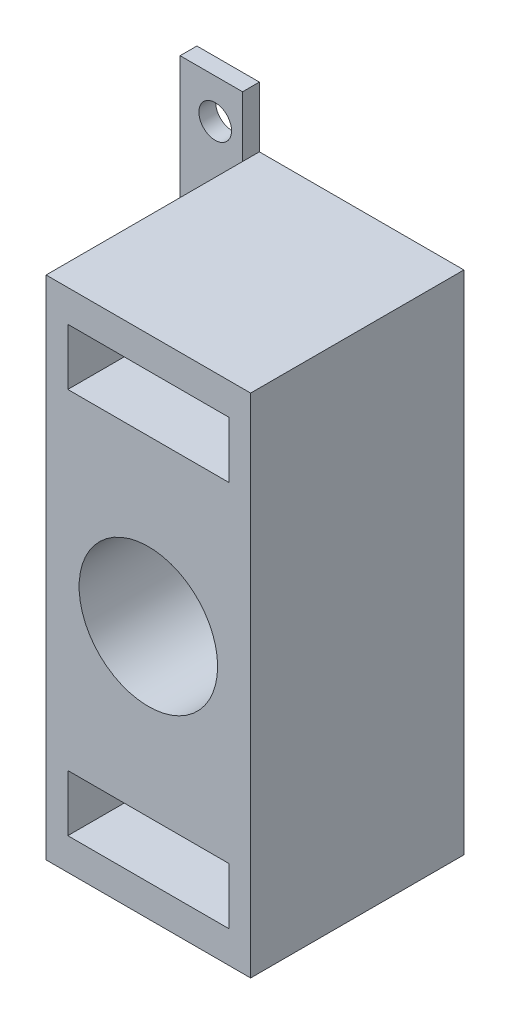
ISO-10303-21;
HEADER;
FILE_DESCRIPTION(('STEP AP214'),'2;1');
FILE_NAME('part.step','',(''),(''),'','','');
FILE_SCHEMA(('AUTOMOTIVE_DESIGN { 1 0 10303 214 1 1 1 1 }'));
ENDSEC;
DATA;
#1=APPLICATION_CONTEXT('core data for automotive mechanical design processes');
#2=APPLICATION_PROTOCOL_DEFINITION('international standard','automotive_design',2000,#1);
#3=PRODUCT_CONTEXT('',#1,'mechanical');
#4=PRODUCT('Part','Part','',(#3));
#5=PRODUCT_RELATED_PRODUCT_CATEGORY('part','',(#4));
#6=PRODUCT_DEFINITION_FORMATION('','',#4);
#7=PRODUCT_DEFINITION_CONTEXT('part definition',#1,'design');
#8=PRODUCT_DEFINITION('design','',#6,#7);
#9=PRODUCT_DEFINITION_SHAPE('','',#8);
#10=(LENGTH_UNIT() NAMED_UNIT(*) SI_UNIT(.MILLI.,.METRE.));
#11=(NAMED_UNIT(*) PLANE_ANGLE_UNIT() SI_UNIT($,.RADIAN.));
#12=(NAMED_UNIT(*) SI_UNIT($,.STERADIAN.) SOLID_ANGLE_UNIT());
#13=UNCERTAINTY_MEASURE_WITH_UNIT(LENGTH_MEASURE(1.E-05),#10,'distance_accuracy_value','');
#14=(GEOMETRIC_REPRESENTATION_CONTEXT(3) GLOBAL_UNCERTAINTY_ASSIGNED_CONTEXT((#13)) GLOBAL_UNIT_ASSIGNED_CONTEXT((#10,
#11,#12)) REPRESENTATION_CONTEXT('',''));
#15=CARTESIAN_POINT('',(0.,0.,0.));
#16=DIRECTION('',(0.,0.,1.));
#17=DIRECTION('',(1.,0.,0.));
#18=AXIS2_PLACEMENT_3D('',#15,#16,#17);
#19=CARTESIAN_POINT('',(-30.4500119994615,75.4141716566866,63.5));
#20=DIRECTION('',(1.,0.,0.));
#21=DIRECTION('',(0.,0.,-1.));
#22=AXIS2_PLACEMENT_3D('',#19,#20,#21);
#23=PLANE('',#22);
#24=DIRECTION('',(0.,1.,0.));
#25=VECTOR('',#24,1.);
#26=CARTESIAN_POINT('',(-30.4500119994615,0.,5.));
#27=LINE('',#26,#25);
#28=CARTESIAN_POINT('',(-30.4500119994615,0.,5.));
#29=VERTEX_POINT('',#28);
#30=CARTESIAN_POINT('',(-30.4500119994615,75.4141716566866,5.));
#31=VERTEX_POINT('',#30);
#32=EDGE_CURVE('E178',#29,#31,#27,.T.);
#33=ORIENTED_EDGE('',*,*,#32,.F.);
#34=DIRECTION('',(0.,0.,-1.));
#35=VECTOR('',#34,1.);
#36=CARTESIAN_POINT('',(-30.4500119994615,0.,5.));
#37=LINE('',#36,#35);
#38=CARTESIAN_POINT('',(-30.4500119994615,0.,0.));
#39=VERTEX_POINT('',#38);
#40=EDGE_CURVE('E181',#29,#39,#37,.T.);
#41=ORIENTED_EDGE('',*,*,#40,.T.);
#42=DIRECTION('',(0.,-1.,0.));
#43=VECTOR('',#42,1.);
#44=CARTESIAN_POINT('',(-30.4500119994615,75.4141716566866,0.));
#45=LINE('',#44,#43);
#46=CARTESIAN_POINT('',(-30.4500119994615,-75.4141716566866,0.));
#47=VERTEX_POINT('',#46);
#48=EDGE_CURVE('E338',#39,#47,#45,.T.);
#49=ORIENTED_EDGE('',*,*,#48,.T.);
#50=DIRECTION('',(0.,0.,-1.));
#51=VECTOR('',#50,1.);
#52=CARTESIAN_POINT('',(-30.4500119994615,-75.4141716566866,63.5));
#53=LINE('',#52,#51);
#54=CARTESIAN_POINT('',(-30.4500119994615,-75.4141716566866,63.5));
#55=VERTEX_POINT('',#54);
#56=EDGE_CURVE('E346',#55,#47,#53,.T.);
#57=ORIENTED_EDGE('',*,*,#56,.F.);
#58=DIRECTION('',(0.,-1.,0.));
#59=VECTOR('',#58,1.);
#60=CARTESIAN_POINT('',(-30.4500119994615,75.4141716566866,63.5));
#61=LINE('',#60,#59);
#62=CARTESIAN_POINT('',(-30.4500119994615,75.4141716566866,63.5));
#63=VERTEX_POINT('',#62);
#64=EDGE_CURVE('E324',#63,#55,#61,.T.);
#65=ORIENTED_EDGE('',*,*,#64,.F.);
#66=DIRECTION('',(0.,0.,-1.));
#67=VECTOR('',#66,1.);
#68=CARTESIAN_POINT('',(-30.4500119994615,75.4141716566866,63.5));
#69=LINE('',#68,#67);
#70=EDGE_CURVE('E50',#63,#31,#69,.T.);
#71=ORIENTED_EDGE('',*,*,#70,.T.);
#72=EDGE_LOOP('',(#33,#41,#49,#57,#65,#71));
#73=FACE_BOUND('',#72,.T.);
#74=ADVANCED_FACE('F41',(#73),#23,.F.);
#75=CARTESIAN_POINT('',(0.,0.,63.5));
#76=DIRECTION('',(0.,0.,1.));
#77=DIRECTION('',(1.,0.,0.));
#78=AXIS2_PLACEMENT_3D('',#75,#76,#77);
#79=PLANE('',#78);
#80=DIRECTION('',(-1.,0.,0.));
#81=VECTOR('',#80,1.);
#82=CARTESIAN_POINT('',(-23.985940143174,65.9335329341317,63.5));
#83=LINE('',#82,#81);
#84=CARTESIAN_POINT('',(23.9859401431741,65.9335329341317,63.5));
#85=VERTEX_POINT('',#84);
#86=CARTESIAN_POINT('',(-23.985940143174,65.9335329341317,63.5));
#87=VERTEX_POINT('',#86);
#88=EDGE_CURVE('E235',#85,#87,#83,.T.);
#89=ORIENTED_EDGE('',*,*,#88,.F.);
#90=DIRECTION('',(0.,1.,0.));
#91=VECTOR('',#90,1.);
#92=CARTESIAN_POINT('',(23.9859401431741,65.9335329341317,63.5));
#93=LINE('',#92,#91);
#94=CARTESIAN_POINT('',(23.9859401431741,49.1269461077844,63.5));
#95=VERTEX_POINT('',#94);
#96=EDGE_CURVE('E232',#95,#85,#93,.T.);
#97=ORIENTED_EDGE('',*,*,#96,.F.);
#98=DIRECTION('',(1.,0.,0.));
#99=VECTOR('',#98,1.);
#100=CARTESIAN_POINT('',(-23.985940143174,49.1269461077844,63.5));
#101=LINE('',#100,#99);
#102=CARTESIAN_POINT('',(-23.985940143174,49.1269461077844,63.5));
#103=VERTEX_POINT('',#102);
#104=EDGE_CURVE('E242',#103,#95,#101,.T.);
#105=ORIENTED_EDGE('',*,*,#104,.F.);
#106=DIRECTION('',(0.,-1.,0.));
#107=VECTOR('',#106,1.);
#108=CARTESIAN_POINT('',(-23.985940143174,65.9335329341317,63.5));
#109=LINE('',#108,#107);
#110=EDGE_CURVE('E239',#87,#103,#109,.T.);
#111=ORIENTED_EDGE('',*,*,#110,.F.);
#112=EDGE_LOOP('',(#89,#97,#105,#111));
#113=FACE_BOUND('',#112,.T.);
#114=DIRECTION('',(1.,0.,0.));
#115=VECTOR('',#114,1.);
#116=CARTESIAN_POINT('',(-23.985940143174,-65.9335329341317,63.5));
#117=LINE('',#116,#115);
#118=CARTESIAN_POINT('',(-23.985940143174,-65.9335329341317,63.5));
#119=VERTEX_POINT('',#118);
#120=CARTESIAN_POINT('',(23.9859401431741,-65.9335329341317,63.5));
#121=VERTEX_POINT('',#120);
#122=EDGE_CURVE('E276',#119,#121,#117,.T.);
#123=ORIENTED_EDGE('',*,*,#122,.F.);
#124=DIRECTION('',(0.,-1.,0.));
#125=VECTOR('',#124,1.);
#126=CARTESIAN_POINT('',(-23.985940143174,-65.9335329341317,63.5));
#127=LINE('',#126,#125);
#128=CARTESIAN_POINT('',(-23.985940143174,-49.1269461077844,63.5));
#129=VERTEX_POINT('',#128);
#130=EDGE_CURVE('E273',#129,#119,#127,.T.);
#131=ORIENTED_EDGE('',*,*,#130,.F.);
#132=DIRECTION('',(-1.,0.,0.));
#133=VECTOR('',#132,1.);
#134=CARTESIAN_POINT('',(-23.985940143174,-49.1269461077844,63.5));
#135=LINE('',#134,#133);
#136=CARTESIAN_POINT('',(23.9859401431741,-49.1269461077844,63.5));
#137=VERTEX_POINT('',#136);
#138=EDGE_CURVE('E284',#137,#129,#135,.T.);
#139=ORIENTED_EDGE('',*,*,#138,.F.);
#140=DIRECTION('',(0.,1.,0.));
#141=VECTOR('',#140,1.);
#142=CARTESIAN_POINT('',(23.9859401431741,-65.9335329341317,63.5));
#143=LINE('',#142,#141);
#144=EDGE_CURVE('E280',#121,#137,#143,.T.);
#145=ORIENTED_EDGE('',*,*,#144,.F.);
#146=EDGE_LOOP('',(#123,#131,#139,#145));
#147=FACE_BOUND('',#146,.T.);
#148=DIRECTION('',(0.,1.,0.));
#149=VECTOR('',#148,1.);
#150=CARTESIAN_POINT('',(30.4500119994615,75.4141716566866,63.5));
#151=LINE('',#150,#149);
#152=CARTESIAN_POINT('',(30.4500119994615,-75.4141716566866,63.5));
#153=VERTEX_POINT('',#152);
#154=CARTESIAN_POINT('',(30.4500119994615,75.4141716566866,63.5));
#155=VERTEX_POINT('',#154);
#156=EDGE_CURVE('E316',#153,#155,#151,.T.);
#157=ORIENTED_EDGE('',*,*,#156,.T.);
#158=DIRECTION('',(-1.,0.,0.));
#159=VECTOR('',#158,1.);
#160=CARTESIAN_POINT('',(-30.4500119994615,75.4141716566866,63.5));
#161=LINE('',#160,#159);
#162=EDGE_CURVE('E320',#155,#63,#161,.T.);
#163=ORIENTED_EDGE('',*,*,#162,.T.);
#164=ORIENTED_EDGE('',*,*,#64,.T.);
#165=DIRECTION('',(1.,0.,0.));
#166=VECTOR('',#165,1.);
#167=CARTESIAN_POINT('',(-30.4500119994615,-75.4141716566866,63.5));
#168=LINE('',#167,#166);
#169=EDGE_CURVE('E327',#55,#153,#168,.T.);
#170=ORIENTED_EDGE('',*,*,#169,.T.);
#171=EDGE_LOOP('',(#157,#163,#164,#170));
#172=FACE_BOUND('',#171,.T.);
#173=CARTESIAN_POINT('',(0.,0.,63.5));
#174=DIRECTION('',(0.,0.,1.));
#175=DIRECTION('',(1.,0.,0.));
#176=AXIS2_PLACEMENT_3D('',#173,#174,#175);
#177=CIRCLE('',#176,20.6182325220097);
#178=CARTESIAN_POINT('',(20.6182325220097,0.,63.5));
#179=VERTEX_POINT('',#178);
#180=EDGE_CURVE('E224',#179,#179,#177,.T.);
#181=ORIENTED_EDGE('',*,*,#180,.F.);
#182=EDGE_LOOP('',(#181));
#183=FACE_BOUND('',#182,.T.);
#184=ADVANCED_FACE('F395',(#113,#147,#172,#183),#79,.T.);
#185=CARTESIAN_POINT('',(0.,0.,0.));
#186=DIRECTION('',(0.,0.,1.));
#187=DIRECTION('',(1.,0.,0.));
#188=AXIS2_PLACEMENT_3D('',#185,#186,#187);
#189=PLANE('',#188);
#190=DIRECTION('',(0.,-1.,0.));
#191=VECTOR('',#190,1.);
#192=CARTESIAN_POINT('',(-23.985940143174,-65.9335329341317,0.));
#193=LINE('',#192,#191);
#194=CARTESIAN_POINT('',(-23.985940143174,-49.1269461077844,0.));
#195=VERTEX_POINT('',#194);
#196=CARTESIAN_POINT('',(-23.985940143174,-65.9335329341317,0.));
#197=VERTEX_POINT('',#196);
#198=EDGE_CURVE('E272',#195,#197,#193,.T.);
#199=ORIENTED_EDGE('',*,*,#198,.T.);
#200=DIRECTION('',(1.,0.,0.));
#201=VECTOR('',#200,1.);
#202=CARTESIAN_POINT('',(-23.985940143174,-65.9335329341317,0.));
#203=LINE('',#202,#201);
#204=CARTESIAN_POINT('',(23.9859401431741,-65.9335329341317,0.));
#205=VERTEX_POINT('',#204);
#206=EDGE_CURVE('E291',#197,#205,#203,.T.);
#207=ORIENTED_EDGE('',*,*,#206,.T.);
#208=DIRECTION('',(0.,1.,0.));
#209=VECTOR('',#208,1.);
#210=CARTESIAN_POINT('',(23.9859401431741,-65.9335329341317,0.));
#211=LINE('',#210,#209);
#212=CARTESIAN_POINT('',(23.9859401431741,-49.1269461077844,0.));
#213=VERTEX_POINT('',#212);
#214=EDGE_CURVE('E295',#205,#213,#211,.T.);
#215=ORIENTED_EDGE('',*,*,#214,.T.);
#216=DIRECTION('',(-1.,0.,0.));
#217=VECTOR('',#216,1.);
#218=CARTESIAN_POINT('',(-23.985940143174,-49.1269461077844,0.));
#219=LINE('',#218,#217);
#220=EDGE_CURVE('E277',#213,#195,#219,.T.);
#221=ORIENTED_EDGE('',*,*,#220,.T.);
#222=EDGE_LOOP('',(#199,#207,#215,#221));
#223=FACE_BOUND('',#222,.T.);
#224=DIRECTION('',(0.,1.,0.));
#225=VECTOR('',#224,1.);
#226=CARTESIAN_POINT('',(30.4500119994615,75.4141716566866,0.));
#227=LINE('',#226,#225);
#228=CARTESIAN_POINT('',(30.4500119994615,-75.4141716566866,0.));
#229=VERTEX_POINT('',#228);
#230=CARTESIAN_POINT('',(30.4500119994615,75.4141716566866,0.));
#231=VERTEX_POINT('',#230);
#232=EDGE_CURVE('E315',#229,#231,#227,.T.);
#233=ORIENTED_EDGE('',*,*,#232,.F.);
#234=DIRECTION('',(1.,0.,0.));
#235=VECTOR('',#234,1.);
#236=CARTESIAN_POINT('',(-30.4500119994615,-75.4141716566866,0.));
#237=LINE('',#236,#235);
#238=EDGE_CURVE('E321',#47,#229,#237,.T.);
#239=ORIENTED_EDGE('',*,*,#238,.F.);
#240=ORIENTED_EDGE('',*,*,#48,.F.);
#241=DIRECTION('',(1.,0.,0.));
#242=VECTOR('',#241,1.);
#243=CARTESIAN_POINT('',(0.,0.,0.));
#244=LINE('',#243,#242);
#245=CARTESIAN_POINT('',(-49.0484048742105,0.,0.));
#246=VERTEX_POINT('',#245);
#247=EDGE_CURVE('E57',#246,#39,#244,.T.);
#248=ORIENTED_EDGE('',*,*,#247,.F.);
#249=DIRECTION('',(0.,-1.,0.));
#250=VECTOR('',#249,1.);
#251=CARTESIAN_POINT('',(-49.0484048742105,0.,0.));
#252=LINE('',#251,#250);
#253=CARTESIAN_POINT('',(-49.0484048742105,93.4052231952363,0.));
#254=VERTEX_POINT('',#253);
#255=EDGE_CURVE('E175',#254,#246,#252,.T.);
#256=ORIENTED_EDGE('',*,*,#255,.F.);
#257=DIRECTION('',(-1.,0.,0.));
#258=VECTOR('',#257,1.);
#259=CARTESIAN_POINT('',(0.,93.4052231952363,0.));
#260=LINE('',#259,#258);
#261=CARTESIAN_POINT('',(-30.4500119994615,93.4052231952363,0.));
#262=VERTEX_POINT('',#261);
#263=EDGE_CURVE('E209',#262,#254,#260,.T.);
#264=ORIENTED_EDGE('',*,*,#263,.F.);
#265=DIRECTION('',(0.,1.,0.));
#266=VECTOR('',#265,1.);
#267=CARTESIAN_POINT('',(-30.4500119994615,0.,0.));
#268=LINE('',#267,#266);
#269=CARTESIAN_POINT('',(-30.4500119994615,75.4141716566866,0.));
#270=VERTEX_POINT('',#269);
#271=EDGE_CURVE('E212',#270,#262,#268,.T.);
#272=ORIENTED_EDGE('',*,*,#271,.F.);
#273=DIRECTION('',(-1.,0.,0.));
#274=VECTOR('',#273,1.);
#275=CARTESIAN_POINT('',(-30.4500119994615,75.4141716566866,0.));
#276=LINE('',#275,#274);
#277=EDGE_CURVE('E334',#231,#270,#276,.T.);
#278=ORIENTED_EDGE('',*,*,#277,.F.);
#279=EDGE_LOOP('',(#233,#239,#240,#248,#256,#264,#272,#278));
#280=FACE_BOUND('',#279,.T.);
#281=DIRECTION('',(0.,1.,0.));
#282=VECTOR('',#281,1.);
#283=CARTESIAN_POINT('',(23.9859401431741,65.9335329341317,0.));
#284=LINE('',#283,#282);
#285=CARTESIAN_POINT('',(23.9859401431741,49.1269461077844,0.));
#286=VERTEX_POINT('',#285);
#287=CARTESIAN_POINT('',(23.9859401431741,65.9335329341317,0.));
#288=VERTEX_POINT('',#287);
#289=EDGE_CURVE('E228',#286,#288,#284,.T.);
#290=ORIENTED_EDGE('',*,*,#289,.T.);
#291=DIRECTION('',(-1.,0.,0.));
#292=VECTOR('',#291,1.);
#293=CARTESIAN_POINT('',(-23.985940143174,65.9335329341317,0.));
#294=LINE('',#293,#292);
#295=CARTESIAN_POINT('',(-23.985940143174,65.9335329341317,0.));
#296=VERTEX_POINT('',#295);
#297=EDGE_CURVE('E249',#288,#296,#294,.T.);
#298=ORIENTED_EDGE('',*,*,#297,.T.);
#299=DIRECTION('',(0.,-1.,0.));
#300=VECTOR('',#299,1.);
#301=CARTESIAN_POINT('',(-23.985940143174,65.9335329341317,0.));
#302=LINE('',#301,#300);
#303=CARTESIAN_POINT('',(-23.985940143174,49.1269461077844,0.));
#304=VERTEX_POINT('',#303);
#305=EDGE_CURVE('E253',#296,#304,#302,.T.);
#306=ORIENTED_EDGE('',*,*,#305,.T.);
#307=DIRECTION('',(1.,0.,0.));
#308=VECTOR('',#307,1.);
#309=CARTESIAN_POINT('',(-23.985940143174,49.1269461077844,0.));
#310=LINE('',#309,#308);
#311=EDGE_CURVE('E236',#304,#286,#310,.T.);
#312=ORIENTED_EDGE('',*,*,#311,.T.);
#313=EDGE_LOOP('',(#290,#298,#306,#312));
#314=FACE_BOUND('',#313,.T.);
#315=CARTESIAN_POINT('',(0.,0.,0.));
#316=DIRECTION('',(0.,0.,1.));
#317=DIRECTION('',(1.,0.,0.));
#318=AXIS2_PLACEMENT_3D('',#315,#316,#317);
#319=CIRCLE('',#318,20.6182325220097);
#320=CARTESIAN_POINT('',(20.6182325220097,0.,0.));
#321=VERTEX_POINT('',#320);
#322=EDGE_CURVE('E217',#321,#321,#319,.T.);
#323=ORIENTED_EDGE('',*,*,#322,.T.);
#324=EDGE_LOOP('',(#323));
#325=FACE_BOUND('',#324,.T.);
#326=CARTESIAN_POINT('',(-38.5989620966613,34.9736452146548,0.));
#327=DIRECTION('',(0.,0.,-1.));
#328=DIRECTION('',(-1.,0.,0.));
#329=AXIS2_PLACEMENT_3D('',#326,#327,#328);
#330=CIRCLE('',#329,5.38228596206866);
#331=CARTESIAN_POINT('',(-43.9812480587299,34.9736452146548,0.));
#332=VERTEX_POINT('',#331);
#333=EDGE_CURVE('E197',#332,#332,#330,.T.);
#334=ORIENTED_EDGE('',*,*,#333,.F.);
#335=EDGE_LOOP('',(#334));
#336=FACE_BOUND('',#335,.T.);
#337=CARTESIAN_POINT('',(-38.5989620966613,81.6762568122729,0.));
#338=DIRECTION('',(0.,0.,-1.));
#339=DIRECTION('',(-1.,0.,0.));
#340=AXIS2_PLACEMENT_3D('',#337,#338,#339);
#341=CIRCLE('',#340,4.86293790242502);
#342=CARTESIAN_POINT('',(-43.4618999990863,81.6762568122729,0.));
#343=VERTEX_POINT('',#342);
#344=EDGE_CURVE('E201',#343,#343,#341,.T.);
#345=ORIENTED_EDGE('',*,*,#344,.F.);
#346=EDGE_LOOP('',(#345));
#347=FACE_BOUND('',#346,.T.);
#348=ADVANCED_FACE('F365',(#223,#280,#314,#325,#336,#347),#189,.F.);
#349=CARTESIAN_POINT('',(30.4500119994615,75.4141716566866,63.5));
#350=DIRECTION('',(-1.,0.,0.));
#351=DIRECTION('',(0.,0.,1.));
#352=AXIS2_PLACEMENT_3D('',#349,#350,#351);
#353=PLANE('',#352);
#354=ORIENTED_EDGE('',*,*,#232,.T.);
#355=DIRECTION('',(0.,0.,-1.));
#356=VECTOR('',#355,1.);
#357=CARTESIAN_POINT('',(30.4500119994615,75.4141716566866,63.5));
#358=LINE('',#357,#356);
#359=EDGE_CURVE('E11',#155,#231,#358,.T.);
#360=ORIENTED_EDGE('',*,*,#359,.F.);
#361=ORIENTED_EDGE('',*,*,#156,.F.);
#362=DIRECTION('',(0.,0.,-1.));
#363=VECTOR('',#362,1.);
#364=CARTESIAN_POINT('',(30.4500119994615,-75.4141716566866,63.5));
#365=LINE('',#364,#363);
#366=EDGE_CURVE('E330',#153,#229,#365,.T.);
#367=ORIENTED_EDGE('',*,*,#366,.T.);
#368=EDGE_LOOP('',(#354,#360,#361,#367));
#369=FACE_BOUND('',#368,.T.);
#370=ADVANCED_FACE('F43',(#369),#353,.F.);
#371=CARTESIAN_POINT('',(-30.4500119994615,75.4141716566866,63.5));
#372=DIRECTION('',(0.,-1.,0.));
#373=DIRECTION('',(0.,0.,-1.));
#374=AXIS2_PLACEMENT_3D('',#371,#372,#373);
#375=PLANE('',#374);
#376=ORIENTED_EDGE('',*,*,#277,.T.);
#377=EDGE_CURVE('E349',#31,#270,#69,.T.);
#378=ORIENTED_EDGE('',*,*,#377,.F.);
#379=ORIENTED_EDGE('',*,*,#70,.F.);
#380=ORIENTED_EDGE('',*,*,#162,.F.);
#381=ORIENTED_EDGE('',*,*,#359,.T.);
#382=EDGE_LOOP('',(#376,#378,#379,#380,#381));
#383=FACE_BOUND('',#382,.T.);
#384=ADVANCED_FACE('F367',(#383),#375,.F.);
#385=CARTESIAN_POINT('',(-30.4500119994615,-75.4141716566866,63.5));
#386=DIRECTION('',(0.,1.,0.));
#387=DIRECTION('',(0.,0.,1.));
#388=AXIS2_PLACEMENT_3D('',#385,#386,#387);
#389=PLANE('',#388);
#390=ORIENTED_EDGE('',*,*,#238,.T.);
#391=ORIENTED_EDGE('',*,*,#366,.F.);
#392=ORIENTED_EDGE('',*,*,#169,.F.);
#393=ORIENTED_EDGE('',*,*,#56,.T.);
#394=EDGE_LOOP('',(#390,#391,#392,#393));
#395=FACE_BOUND('',#394,.T.);
#396=ADVANCED_FACE('F375',(#395),#389,.F.);
#397=CARTESIAN_POINT('',(-23.985940143174,-65.9335329341317,63.5));
#398=DIRECTION('',(1.,0.,0.));
#399=DIRECTION('',(0.,0.,-1.));
#400=AXIS2_PLACEMENT_3D('',#397,#398,#399);
#401=PLANE('',#400);
#402=ORIENTED_EDGE('',*,*,#198,.F.);
#403=DIRECTION('',(0.,0.,-1.));
#404=VECTOR('',#403,1.);
#405=CARTESIAN_POINT('',(-23.985940143174,-49.1269461077844,63.5));
#406=LINE('',#405,#404);
#407=EDGE_CURVE('E287',#129,#195,#406,.T.);
#408=ORIENTED_EDGE('',*,*,#407,.F.);
#409=ORIENTED_EDGE('',*,*,#130,.T.);
#410=DIRECTION('',(0.,0.,-1.));
#411=VECTOR('',#410,1.);
#412=CARTESIAN_POINT('',(-23.985940143174,-65.9335329341317,63.5));
#413=LINE('',#412,#411);
#414=EDGE_CURVE('E311',#119,#197,#413,.T.);
#415=ORIENTED_EDGE('',*,*,#414,.T.);
#416=EDGE_LOOP('',(#402,#408,#409,#415));
#417=FACE_BOUND('',#416,.T.);
#418=ADVANCED_FACE('F409',(#417),#401,.T.);
#419=CARTESIAN_POINT('',(-23.985940143174,-65.9335329341317,63.5));
#420=DIRECTION('',(0.,1.,0.));
#421=DIRECTION('',(0.,0.,1.));
#422=AXIS2_PLACEMENT_3D('',#419,#420,#421);
#423=PLANE('',#422);
#424=ORIENTED_EDGE('',*,*,#206,.F.);
#425=ORIENTED_EDGE('',*,*,#414,.F.);
#426=ORIENTED_EDGE('',*,*,#122,.T.);
#427=DIRECTION('',(0.,0.,-1.));
#428=VECTOR('',#427,1.);
#429=CARTESIAN_POINT('',(23.9859401431741,-65.9335329341317,63.5));
#430=LINE('',#429,#428);
#431=EDGE_CURVE('E308',#121,#205,#430,.T.);
#432=ORIENTED_EDGE('',*,*,#431,.T.);
#433=EDGE_LOOP('',(#424,#425,#426,#432));
#434=FACE_BOUND('',#433,.T.);
#435=ADVANCED_FACE('F419',(#434),#423,.T.);
#436=CARTESIAN_POINT('',(23.9859401431741,-65.9335329341317,63.5));
#437=DIRECTION('',(-1.,0.,0.));
#438=DIRECTION('',(0.,0.,1.));
#439=AXIS2_PLACEMENT_3D('',#436,#437,#438);
#440=PLANE('',#439);
#441=ORIENTED_EDGE('',*,*,#214,.F.);
#442=ORIENTED_EDGE('',*,*,#431,.F.);
#443=ORIENTED_EDGE('',*,*,#144,.T.);
#444=DIRECTION('',(0.,0.,-1.));
#445=VECTOR('',#444,1.);
#446=CARTESIAN_POINT('',(23.9859401431741,-49.1269461077844,63.5));
#447=LINE('',#446,#445);
#448=EDGE_CURVE('E305',#137,#213,#447,.T.);
#449=ORIENTED_EDGE('',*,*,#448,.T.);
#450=EDGE_LOOP('',(#441,#442,#443,#449));
#451=FACE_BOUND('',#450,.T.);
#452=ADVANCED_FACE('F423',(#451),#440,.T.);
#453=CARTESIAN_POINT('',(-23.985940143174,-49.1269461077844,63.5));
#454=DIRECTION('',(0.,-1.,0.));
#455=DIRECTION('',(0.,0.,-1.));
#456=AXIS2_PLACEMENT_3D('',#453,#454,#455);
#457=PLANE('',#456);
#458=ORIENTED_EDGE('',*,*,#220,.F.);
#459=ORIENTED_EDGE('',*,*,#448,.F.);
#460=ORIENTED_EDGE('',*,*,#138,.T.);
#461=ORIENTED_EDGE('',*,*,#407,.T.);
#462=EDGE_LOOP('',(#458,#459,#460,#461));
#463=FACE_BOUND('',#462,.T.);
#464=ADVANCED_FACE('F427',(#463),#457,.T.);
#465=CARTESIAN_POINT('',(23.9859401431741,65.9335329341317,63.5));
#466=DIRECTION('',(-1.,0.,0.));
#467=DIRECTION('',(0.,0.,1.));
#468=AXIS2_PLACEMENT_3D('',#465,#466,#467);
#469=PLANE('',#468);
#470=ORIENTED_EDGE('',*,*,#289,.F.);
#471=DIRECTION('',(0.,0.,-1.));
#472=VECTOR('',#471,1.);
#473=CARTESIAN_POINT('',(23.9859401431741,49.1269461077844,63.5));
#474=LINE('',#473,#472);
#475=EDGE_CURVE('E245',#95,#286,#474,.T.);
#476=ORIENTED_EDGE('',*,*,#475,.F.);
#477=ORIENTED_EDGE('',*,*,#96,.T.);
#478=DIRECTION('',(0.,0.,-1.));
#479=VECTOR('',#478,1.);
#480=CARTESIAN_POINT('',(23.9859401431741,65.9335329341317,63.5));
#481=LINE('',#480,#479);
#482=EDGE_CURVE('E268',#85,#288,#481,.T.);
#483=ORIENTED_EDGE('',*,*,#482,.T.);
#484=EDGE_LOOP('',(#470,#476,#477,#483));
#485=FACE_BOUND('',#484,.T.);
#486=ADVANCED_FACE('F431',(#485),#469,.T.);
#487=CARTESIAN_POINT('',(-23.985940143174,65.9335329341317,63.5));
#488=DIRECTION('',(0.,-1.,0.));
#489=DIRECTION('',(0.,0.,-1.));
#490=AXIS2_PLACEMENT_3D('',#487,#488,#489);
#491=PLANE('',#490);
#492=ORIENTED_EDGE('',*,*,#297,.F.);
#493=ORIENTED_EDGE('',*,*,#482,.F.);
#494=ORIENTED_EDGE('',*,*,#88,.T.);
#495=DIRECTION('',(0.,0.,-1.));
#496=VECTOR('',#495,1.);
#497=CARTESIAN_POINT('',(-23.985940143174,65.9335329341317,63.5));
#498=LINE('',#497,#496);
#499=EDGE_CURVE('E265',#87,#296,#498,.T.);
#500=ORIENTED_EDGE('',*,*,#499,.T.);
#501=EDGE_LOOP('',(#492,#493,#494,#500));
#502=FACE_BOUND('',#501,.T.);
#503=ADVANCED_FACE('F435',(#502),#491,.T.);
#504=CARTESIAN_POINT('',(-23.985940143174,65.9335329341317,63.5));
#505=DIRECTION('',(1.,0.,0.));
#506=DIRECTION('',(0.,0.,-1.));
#507=AXIS2_PLACEMENT_3D('',#504,#505,#506);
#508=PLANE('',#507);
#509=ORIENTED_EDGE('',*,*,#305,.F.);
#510=ORIENTED_EDGE('',*,*,#499,.F.);
#511=ORIENTED_EDGE('',*,*,#110,.T.);
#512=DIRECTION('',(0.,0.,-1.));
#513=VECTOR('',#512,1.);
#514=CARTESIAN_POINT('',(-23.985940143174,49.1269461077844,63.5));
#515=LINE('',#514,#513);
#516=EDGE_CURVE('E65',#103,#304,#515,.T.);
#517=ORIENTED_EDGE('',*,*,#516,.T.);
#518=EDGE_LOOP('',(#509,#510,#511,#517));
#519=FACE_BOUND('',#518,.T.);
#520=ADVANCED_FACE('F439',(#519),#508,.T.);
#521=CARTESIAN_POINT('',(-23.985940143174,49.1269461077844,63.5));
#522=DIRECTION('',(0.,1.,0.));
#523=DIRECTION('',(0.,0.,1.));
#524=AXIS2_PLACEMENT_3D('',#521,#522,#523);
#525=PLANE('',#524);
#526=ORIENTED_EDGE('',*,*,#311,.F.);
#527=ORIENTED_EDGE('',*,*,#516,.F.);
#528=ORIENTED_EDGE('',*,*,#104,.T.);
#529=ORIENTED_EDGE('',*,*,#475,.T.);
#530=EDGE_LOOP('',(#526,#527,#528,#529));
#531=FACE_BOUND('',#530,.T.);
#532=ADVANCED_FACE('F443',(#531),#525,.T.);
#533=CARTESIAN_POINT('',(0.,0.,63.5));
#534=DIRECTION('',(0.,0.,-1.));
#535=DIRECTION('',(-1.,0.,0.));
#536=AXIS2_PLACEMENT_3D('',#533,#534,#535);
#537=CYLINDRICAL_SURFACE('',#536,20.6182325220097);
#538=ORIENTED_EDGE('',*,*,#180,.T.);
#539=EDGE_LOOP('',(#538));
#540=FACE_BOUND('',#539,.T.);
#541=ORIENTED_EDGE('',*,*,#322,.F.);
#542=EDGE_LOOP('',(#541));
#543=FACE_BOUND('',#542,.T.);
#544=ADVANCED_FACE('F447',(#540,#543),#537,.F.);
#545=CARTESIAN_POINT('',(-30.4500119994615,0.,5.));
#546=DIRECTION('',(-1.,0.,0.));
#547=DIRECTION('',(0.,0.,1.));
#548=AXIS2_PLACEMENT_3D('',#545,#546,#547);
#549=PLANE('',#548);
#550=CARTESIAN_POINT('',(-30.4500119994615,93.4052231952363,5.));
#551=VERTEX_POINT('',#550);
#552=EDGE_CURVE('E194',#31,#551,#27,.T.);
#553=ORIENTED_EDGE('',*,*,#552,.F.);
#554=ORIENTED_EDGE('',*,*,#377,.T.);
#555=ORIENTED_EDGE('',*,*,#271,.T.);
#556=DIRECTION('',(0.,0.,-1.));
#557=VECTOR('',#556,1.);
#558=CARTESIAN_POINT('',(-30.4500119994615,93.4052231952363,5.));
#559=LINE('',#558,#557);
#560=EDGE_CURVE('E218',#551,#262,#559,.T.);
#561=ORIENTED_EDGE('',*,*,#560,.F.);
#562=EDGE_LOOP('',(#553,#554,#555,#561));
#563=FACE_BOUND('',#562,.T.);
#564=ADVANCED_FACE('F359',(#563),#549,.F.);
#565=CARTESIAN_POINT('',(0.,0.,5.));
#566=DIRECTION('',(0.,1.,0.));
#567=DIRECTION('',(0.,0.,1.));
#568=AXIS2_PLACEMENT_3D('',#565,#566,#567);
#569=PLANE('',#568);
#570=ORIENTED_EDGE('',*,*,#247,.T.);
#571=ORIENTED_EDGE('',*,*,#40,.F.);
#572=DIRECTION('',(1.,0.,0.));
#573=VECTOR('',#572,1.);
#574=CARTESIAN_POINT('',(0.,0.,5.));
#575=LINE('',#574,#573);
#576=CARTESIAN_POINT('',(-49.0484048742105,0.,5.));
#577=VERTEX_POINT('',#576);
#578=EDGE_CURVE('E164',#577,#29,#575,.T.);
#579=ORIENTED_EDGE('',*,*,#578,.F.);
#580=DIRECTION('',(0.,0.,-1.));
#581=VECTOR('',#580,1.);
#582=CARTESIAN_POINT('',(-49.0484048742105,0.,5.));
#583=LINE('',#582,#581);
#584=EDGE_CURVE('E172',#577,#246,#583,.T.);
#585=ORIENTED_EDGE('',*,*,#584,.T.);
#586=EDGE_LOOP('',(#570,#571,#579,#585));
#587=FACE_BOUND('',#586,.T.);
#588=ADVANCED_FACE('F180',(#587),#569,.F.);
#589=CARTESIAN_POINT('',(0.,93.4052231952363,5.));
#590=DIRECTION('',(0.,-1.,0.));
#591=DIRECTION('',(0.,0.,-1.));
#592=AXIS2_PLACEMENT_3D('',#589,#590,#591);
#593=PLANE('',#592);
#594=ORIENTED_EDGE('',*,*,#263,.T.);
#595=DIRECTION('',(0.,0.,-1.));
#596=VECTOR('',#595,1.);
#597=CARTESIAN_POINT('',(-49.0484048742105,93.4052231952363,5.));
#598=LINE('',#597,#596);
#599=CARTESIAN_POINT('',(-49.0484048742105,93.4052231952363,5.));
#600=VERTEX_POINT('',#599);
#601=EDGE_CURVE('E177',#600,#254,#598,.T.);
#602=ORIENTED_EDGE('',*,*,#601,.F.);
#603=DIRECTION('',(-1.,0.,0.));
#604=VECTOR('',#603,1.);
#605=CARTESIAN_POINT('',(0.,93.4052231952363,5.));
#606=LINE('',#605,#604);
#607=EDGE_CURVE('E166',#551,#600,#606,.T.);
#608=ORIENTED_EDGE('',*,*,#607,.F.);
#609=ORIENTED_EDGE('',*,*,#560,.T.);
#610=EDGE_LOOP('',(#594,#602,#608,#609));
#611=FACE_BOUND('',#610,.T.);
#612=ADVANCED_FACE('F380',(#611),#593,.F.);
#613=CARTESIAN_POINT('',(-38.5989620966613,81.6762568122729,5.));
#614=DIRECTION('',(0.,0.,-1.));
#615=DIRECTION('',(-1.,0.,0.));
#616=AXIS2_PLACEMENT_3D('',#613,#614,#615);
#617=CYLINDRICAL_SURFACE('',#616,4.86293790242502);
#618=CARTESIAN_POINT('',(-38.5989620966613,81.6762568122729,5.));
#619=DIRECTION('',(0.,0.,-1.));
#620=DIRECTION('',(-1.,0.,0.));
#621=AXIS2_PLACEMENT_3D('',#618,#619,#620);
#622=CIRCLE('',#621,4.86293790242502);
#623=CARTESIAN_POINT('',(-43.4618999990863,81.6762568122729,5.));
#624=VERTEX_POINT('',#623);
#625=EDGE_CURVE('E184',#624,#624,#622,.T.);
#626=ORIENTED_EDGE('',*,*,#625,.F.);
#627=EDGE_LOOP('',(#626));
#628=FACE_BOUND('',#627,.T.);
#629=ORIENTED_EDGE('',*,*,#344,.T.);
#630=EDGE_LOOP('',(#629));
#631=FACE_BOUND('',#630,.T.);
#632=ADVANCED_FACE('F382',(#628,#631),#617,.F.);
#633=CARTESIAN_POINT('',(-38.5989620966613,34.9736452146548,5.));
#634=DIRECTION('',(0.,0.,-1.));
#635=DIRECTION('',(-1.,0.,0.));
#636=AXIS2_PLACEMENT_3D('',#633,#634,#635);
#637=CYLINDRICAL_SURFACE('',#636,5.38228596206866);
#638=CARTESIAN_POINT('',(-38.5989620966613,34.9736452146548,5.));
#639=DIRECTION('',(0.,0.,-1.));
#640=DIRECTION('',(-1.,0.,0.));
#641=AXIS2_PLACEMENT_3D('',#638,#639,#640);
#642=CIRCLE('',#641,5.38228596206866);
#643=CARTESIAN_POINT('',(-43.9812480587299,34.9736452146548,5.));
#644=VERTEX_POINT('',#643);
#645=EDGE_CURVE('E188',#644,#644,#642,.T.);
#646=ORIENTED_EDGE('',*,*,#645,.F.);
#647=EDGE_LOOP('',(#646));
#648=FACE_BOUND('',#647,.T.);
#649=ORIENTED_EDGE('',*,*,#333,.T.);
#650=EDGE_LOOP('',(#649));
#651=FACE_BOUND('',#650,.T.);
#652=ADVANCED_FACE('F388',(#648,#651),#637,.F.);
#653=CARTESIAN_POINT('',(-49.0484048742105,0.,5.));
#654=DIRECTION('',(1.,0.,0.));
#655=DIRECTION('',(0.,0.,-1.));
#656=AXIS2_PLACEMENT_3D('',#653,#654,#655);
#657=PLANE('',#656);
#658=ORIENTED_EDGE('',*,*,#255,.T.);
#659=ORIENTED_EDGE('',*,*,#584,.F.);
#660=DIRECTION('',(0.,-1.,0.));
#661=VECTOR('',#660,1.);
#662=CARTESIAN_POINT('',(-49.0484048742105,0.,5.));
#663=LINE('',#662,#661);
#664=EDGE_CURVE('E159',#600,#577,#663,.T.);
#665=ORIENTED_EDGE('',*,*,#664,.F.);
#666=ORIENTED_EDGE('',*,*,#601,.T.);
#667=EDGE_LOOP('',(#658,#659,#665,#666));
#668=FACE_BOUND('',#667,.T.);
#669=ADVANCED_FACE('F173',(#668),#657,.F.);
#670=CARTESIAN_POINT('',(0.,0.,5.));
#671=DIRECTION('',(0.,0.,-1.));
#672=DIRECTION('',(-1.,0.,0.));
#673=AXIS2_PLACEMENT_3D('',#670,#671,#672);
#674=PLANE('',#673);
#675=ORIENTED_EDGE('',*,*,#645,.T.);
#676=EDGE_LOOP('',(#675));
#677=FACE_BOUND('',#676,.T.);
#678=ORIENTED_EDGE('',*,*,#625,.T.);
#679=EDGE_LOOP('',(#678));
#680=FACE_BOUND('',#679,.T.);
#681=ORIENTED_EDGE('',*,*,#578,.T.);
#682=ORIENTED_EDGE('',*,*,#32,.T.);
#683=ORIENTED_EDGE('',*,*,#552,.T.);
#684=ORIENTED_EDGE('',*,*,#607,.T.);
#685=ORIENTED_EDGE('',*,*,#664,.T.);
#686=EDGE_LOOP('',(#681,#682,#683,#684,#685));
#687=FACE_BOUND('',#686,.T.);
#688=ADVANCED_FACE('F161',(#677,#680,#687),#674,.F.);
#689=CLOSED_SHELL('',(#74,#184,#348,#370,#384,#396,#418,#435,#452,#464,#486,#503,#520,#532,#544,
#564,#588,#612,#632,#652,#669,#688));
#690=MANIFOLD_SOLID_BREP('B2',#689);
#691=ADVANCED_BREP_SHAPE_REPRESENTATION('',(#18,#690),#14);
#692=SHAPE_DEFINITION_REPRESENTATION(#9,#691);
ENDSEC;
END-ISO-10303-21;
